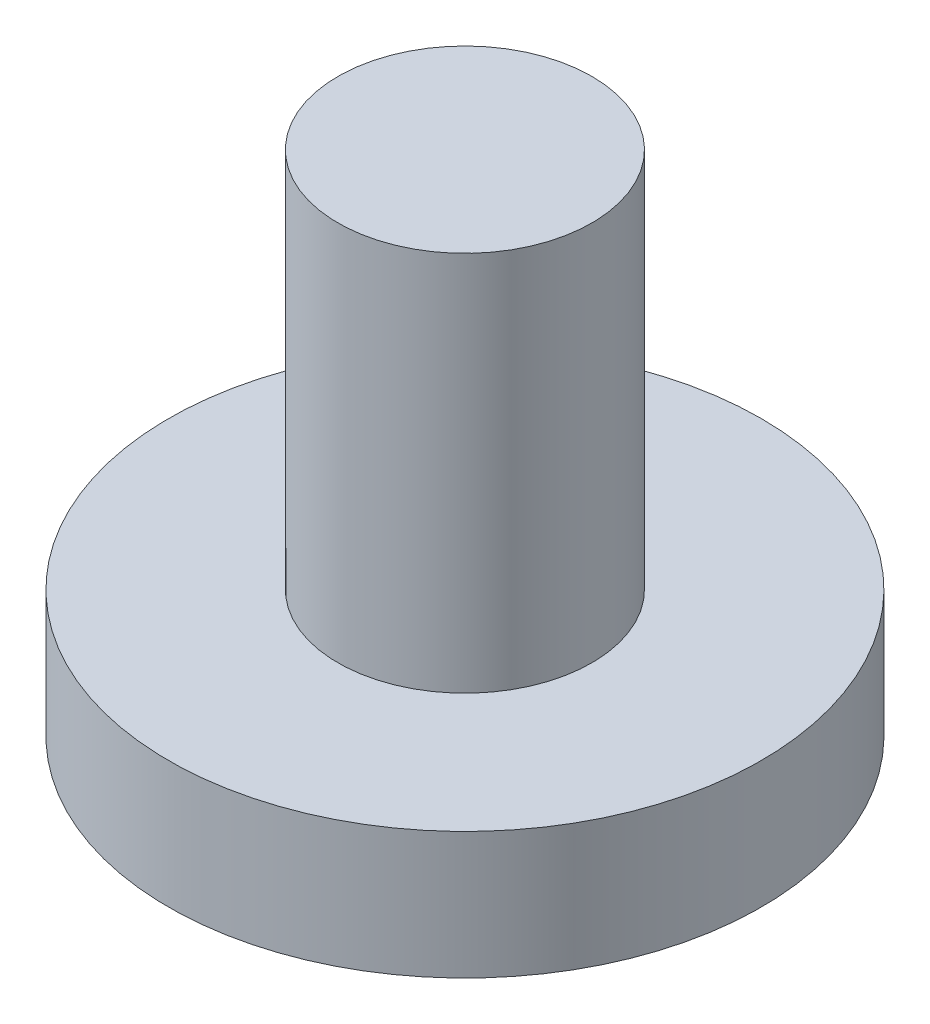
ISO-10303-21;
HEADER;
FILE_DESCRIPTION(('STEP AP214'),'2;1');
FILE_NAME('part.step','',(''),(''),'','','');
FILE_SCHEMA(('AUTOMOTIVE_DESIGN { 1 0 10303 214 1 1 1 1 }'));
ENDSEC;
DATA;
#1=APPLICATION_CONTEXT('core data for automotive mechanical design processes');
#2=APPLICATION_PROTOCOL_DEFINITION('international standard','automotive_design',2000,#1);
#3=PRODUCT_CONTEXT('',#1,'mechanical');
#4=PRODUCT('Part','Part','',(#3));
#5=PRODUCT_RELATED_PRODUCT_CATEGORY('part','',(#4));
#6=PRODUCT_DEFINITION_FORMATION('','',#4);
#7=PRODUCT_DEFINITION_CONTEXT('part definition',#1,'design');
#8=PRODUCT_DEFINITION('design','',#6,#7);
#9=PRODUCT_DEFINITION_SHAPE('','',#8);
#10=(LENGTH_UNIT() NAMED_UNIT(*) SI_UNIT(.MILLI.,.METRE.));
#11=(NAMED_UNIT(*) PLANE_ANGLE_UNIT() SI_UNIT($,.RADIAN.));
#12=(NAMED_UNIT(*) SI_UNIT($,.STERADIAN.) SOLID_ANGLE_UNIT());
#13=UNCERTAINTY_MEASURE_WITH_UNIT(LENGTH_MEASURE(1.E-05),#10,'distance_accuracy_value','');
#14=(GEOMETRIC_REPRESENTATION_CONTEXT(3) GLOBAL_UNCERTAINTY_ASSIGNED_CONTEXT((#13)) GLOBAL_UNIT_ASSIGNED_CONTEXT((#10,
#11,#12)) REPRESENTATION_CONTEXT('',''));
#15=CARTESIAN_POINT('',(0.,0.,0.));
#16=DIRECTION('',(0.,0.,1.));
#17=DIRECTION('',(1.,0.,0.));
#18=AXIS2_PLACEMENT_3D('',#15,#16,#17);
#19=CARTESIAN_POINT('',(0.,6.,0.));
#20=DIRECTION('',(0.,1.,0.));
#21=DIRECTION('',(0.,0.,1.));
#22=AXIS2_PLACEMENT_3D('',#19,#20,#21);
#23=PLANE('',#22);
#24=CARTESIAN_POINT('',(0.,6.,0.));
#25=DIRECTION('',(0.,-1.,0.));
#26=DIRECTION('',(0.,0.,-1.));
#27=AXIS2_PLACEMENT_3D('',#24,#25,#26);
#28=CIRCLE('',#27,1.5);
#29=CARTESIAN_POINT('',(0.,6.,-1.5));
#30=VERTEX_POINT('',#29);
#31=EDGE_CURVE('E19',#30,#30,#28,.T.);
#32=ORIENTED_EDGE('',*,*,#31,.F.);
#33=EDGE_LOOP('',(#32));
#34=FACE_BOUND('',#33,.T.);
#35=ADVANCED_FACE('F16',(#34),#23,.T.);
#36=CARTESIAN_POINT('',(0.,6.,0.));
#37=DIRECTION('',(0.,-1.,0.));
#38=DIRECTION('',(0.,0.,-1.));
#39=AXIS2_PLACEMENT_3D('',#36,#37,#38);
#40=CYLINDRICAL_SURFACE('',#39,1.5);
#41=CARTESIAN_POINT('',(0.,1.5,0.));
#42=DIRECTION('',(0.,-1.,0.));
#43=DIRECTION('',(0.,0.,-1.));
#44=AXIS2_PLACEMENT_3D('',#41,#42,#43);
#45=CIRCLE('',#44,1.5);
#46=CARTESIAN_POINT('',(0.,1.5,-1.5));
#47=VERTEX_POINT('',#46);
#48=EDGE_CURVE('E78',#47,#47,#45,.T.);
#49=ORIENTED_EDGE('',*,*,#48,.F.);
#50=EDGE_LOOP('',(#49));
#51=FACE_BOUND('',#50,.T.);
#52=ORIENTED_EDGE('',*,*,#31,.T.);
#53=EDGE_LOOP('',(#52));
#54=FACE_BOUND('',#53,.T.);
#55=ADVANCED_FACE('F102',(#51,#54),#40,.T.);
#56=CARTESIAN_POINT('',(0.,0.8,0.));
#57=DIRECTION('',(0.,-1.,0.));
#58=DIRECTION('',(0.,0.,-1.));
#59=AXIS2_PLACEMENT_3D('',#56,#57,#58);
#60=PLANE('',#59);
#61=DIRECTION('',(-0.5,0.,0.866025403784439));
#62=VECTOR('',#61,1.);
#63=CARTESIAN_POINT('',(-1.15470053837925,0.8,0.));
#64=LINE('',#63,#62);
#65=CARTESIAN_POINT('',(-1.15470053837925,0.8,0.));
#66=VERTEX_POINT('',#65);
#67=CARTESIAN_POINT('',(-0.577350269189626,0.8,-1.));
#68=VERTEX_POINT('',#67);
#69=EDGE_CURVE('E232',#66,#68,#64,.F.);
#70=ORIENTED_EDGE('',*,*,#69,.T.);
#71=DIRECTION('',(-1.,0.,0.));
#72=VECTOR('',#71,1.);
#73=CARTESIAN_POINT('',(-0.577350269189626,0.8,-1.));
#74=LINE('',#73,#72);
#75=CARTESIAN_POINT('',(0.577350269189627,0.8,-1.));
#76=VERTEX_POINT('',#75);
#77=EDGE_CURVE('E238',#68,#76,#74,.F.);
#78=ORIENTED_EDGE('',*,*,#77,.T.);
#79=DIRECTION('',(-0.5,0.,-0.866025403784439));
#80=VECTOR('',#79,1.);
#81=CARTESIAN_POINT('',(0.577350269189627,0.8,-1.));
#82=LINE('',#81,#80);
#83=CARTESIAN_POINT('',(1.15470053837925,0.8,0.));
#84=VERTEX_POINT('',#83);
#85=EDGE_CURVE('E246',#76,#84,#82,.F.);
#86=ORIENTED_EDGE('',*,*,#85,.T.);
#87=DIRECTION('',(0.5,0.,-0.866025403784439));
#88=VECTOR('',#87,1.);
#89=CARTESIAN_POINT('',(1.15470053837925,0.8,0.));
#90=LINE('',#89,#88);
#91=CARTESIAN_POINT('',(0.577350269189625,0.8,1.));
#92=VERTEX_POINT('',#91);
#93=EDGE_CURVE('E72',#84,#92,#90,.F.);
#94=ORIENTED_EDGE('',*,*,#93,.T.);
#95=DIRECTION('',(1.,0.,0.));
#96=VECTOR('',#95,1.);
#97=CARTESIAN_POINT('',(0.577350269189625,0.8,1.));
#98=LINE('',#97,#96);
#99=CARTESIAN_POINT('',(-0.577350269189626,0.8,1.));
#100=VERTEX_POINT('',#99);
#101=EDGE_CURVE('E70',#92,#100,#98,.F.);
#102=ORIENTED_EDGE('',*,*,#101,.T.);
#103=DIRECTION('',(0.5,0.,0.866025403784439));
#104=VECTOR('',#103,1.);
#105=CARTESIAN_POINT('',(-0.577350269189626,0.8,1.));
#106=LINE('',#105,#104);
#107=EDGE_CURVE('E67',#100,#66,#106,.F.);
#108=ORIENTED_EDGE('',*,*,#107,.T.);
#109=EDGE_LOOP('',(#70,#78,#86,#94,#102,#108));
#110=FACE_BOUND('',#109,.T.);
#111=ADVANCED_FACE('F71',(#110),#60,.T.);
#112=CARTESIAN_POINT('',(0.,1.5,0.));
#113=DIRECTION('',(0.,1.,0.));
#114=DIRECTION('',(0.,0.,1.));
#115=AXIS2_PLACEMENT_3D('',#112,#113,#114);
#116=PLANE('',#115);
#117=ORIENTED_EDGE('',*,*,#48,.T.);
#118=EDGE_LOOP('',(#117));
#119=FACE_BOUND('',#118,.T.);
#120=CARTESIAN_POINT('',(0.,1.5,0.));
#121=DIRECTION('',(0.,-1.,0.));
#122=DIRECTION('',(0.,0.,-1.));
#123=AXIS2_PLACEMENT_3D('',#120,#121,#122);
#124=CIRCLE('',#123,3.5);
#125=CARTESIAN_POINT('',(0.,1.5,-3.5));
#126=VERTEX_POINT('',#125);
#127=EDGE_CURVE('E93',#126,#126,#124,.T.);
#128=ORIENTED_EDGE('',*,*,#127,.F.);
#129=EDGE_LOOP('',(#128));
#130=FACE_BOUND('',#129,.T.);
#131=ADVANCED_FACE('F142',(#119,#130),#116,.T.);
#132=CARTESIAN_POINT('',(0.577350269189625,0.8,1.));
#133=DIRECTION('',(0.,0.,1.));
#134=DIRECTION('',(1.,0.,0.));
#135=AXIS2_PLACEMENT_3D('',#132,#133,#134);
#136=PLANE('',#135);
#137=DIRECTION('',(0.,1.,0.));
#138=VECTOR('',#137,1.);
#139=CARTESIAN_POINT('',(-0.577350269189626,0.8,1.));
#140=LINE('',#139,#138);
#141=CARTESIAN_POINT('',(-0.577350269189626,0.,1.));
#142=VERTEX_POINT('',#141);
#143=EDGE_CURVE('E77',#142,#100,#140,.T.);
#144=ORIENTED_EDGE('',*,*,#143,.T.);
#145=ORIENTED_EDGE('',*,*,#101,.F.);
#146=DIRECTION('',(0.,1.,0.));
#147=VECTOR('',#146,1.);
#148=CARTESIAN_POINT('',(0.577350269189625,0.8,1.));
#149=LINE('',#148,#147);
#150=CARTESIAN_POINT('',(0.577350269189625,0.,1.));
#151=VERTEX_POINT('',#150);
#152=EDGE_CURVE('E95',#92,#151,#149,.F.);
#153=ORIENTED_EDGE('',*,*,#152,.T.);
#154=DIRECTION('',(1.,0.,0.));
#155=VECTOR('',#154,1.);
#156=CARTESIAN_POINT('',(0.,0.,1.));
#157=LINE('',#156,#155);
#158=EDGE_CURVE('E89',#151,#142,#157,.F.);
#159=ORIENTED_EDGE('',*,*,#158,.T.);
#160=EDGE_LOOP('',(#144,#145,#153,#159));
#161=FACE_BOUND('',#160,.T.);
#162=ADVANCED_FACE('F88',(#161),#136,.F.);
#163=CARTESIAN_POINT('',(-0.577350269189626,0.8,1.));
#164=DIRECTION('',(-0.866025403784439,0.,0.5));
#165=DIRECTION('',(0.5,0.,0.866025403784439));
#166=AXIS2_PLACEMENT_3D('',#163,#164,#165);
#167=PLANE('',#166);
#168=DIRECTION('',(0.,1.,0.));
#169=VECTOR('',#168,1.);
#170=CARTESIAN_POINT('',(-1.15470053837925,0.8,0.));
#171=LINE('',#170,#169);
#172=CARTESIAN_POINT('',(-1.15470053837925,0.,0.));
#173=VERTEX_POINT('',#172);
#174=EDGE_CURVE('E85',#173,#66,#171,.T.);
#175=ORIENTED_EDGE('',*,*,#174,.T.);
#176=ORIENTED_EDGE('',*,*,#107,.F.);
#177=ORIENTED_EDGE('',*,*,#143,.F.);
#178=DIRECTION('',(-0.5,0.,-0.866025403784439));
#179=VECTOR('',#178,1.);
#180=CARTESIAN_POINT('',(-0.577350269189626,0.,1.));
#181=LINE('',#180,#179);
#182=EDGE_CURVE('E252',#142,#173,#181,.T.);
#183=ORIENTED_EDGE('',*,*,#182,.T.);
#184=EDGE_LOOP('',(#175,#176,#177,#183));
#185=FACE_BOUND('',#184,.T.);
#186=ADVANCED_FACE('F82',(#185),#167,.F.);
#187=CARTESIAN_POINT('',(-1.15470053837925,0.8,0.));
#188=DIRECTION('',(-0.866025403784439,0.,-0.5));
#189=DIRECTION('',(-0.5,0.,0.866025403784439));
#190=AXIS2_PLACEMENT_3D('',#187,#188,#189);
#191=PLANE('',#190);
#192=DIRECTION('',(0.,1.,0.));
#193=VECTOR('',#192,1.);
#194=CARTESIAN_POINT('',(-0.577350269189626,0.8,-1.));
#195=LINE('',#194,#193);
#196=CARTESIAN_POINT('',(-0.577350269189626,0.,-1.));
#197=VERTEX_POINT('',#196);
#198=EDGE_CURVE('E231',#197,#68,#195,.T.);
#199=ORIENTED_EDGE('',*,*,#198,.T.);
#200=ORIENTED_EDGE('',*,*,#69,.F.);
#201=ORIENTED_EDGE('',*,*,#174,.F.);
#202=DIRECTION('',(0.5,0.,-0.866025403784439));
#203=VECTOR('',#202,1.);
#204=CARTESIAN_POINT('',(-1.15470053837925,0.,0.));
#205=LINE('',#204,#203);
#206=EDGE_CURVE('E234',#173,#197,#205,.T.);
#207=ORIENTED_EDGE('',*,*,#206,.T.);
#208=EDGE_LOOP('',(#199,#200,#201,#207));
#209=FACE_BOUND('',#208,.T.);
#210=ADVANCED_FACE('F133',(#209),#191,.F.);
#211=CARTESIAN_POINT('',(-0.577350269189626,0.8,-1.));
#212=DIRECTION('',(0.,0.,-1.));
#213=DIRECTION('',(-1.,0.,0.));
#214=AXIS2_PLACEMENT_3D('',#211,#212,#213);
#215=PLANE('',#214);
#216=DIRECTION('',(0.,1.,0.));
#217=VECTOR('',#216,1.);
#218=CARTESIAN_POINT('',(0.577350269189627,0.8,-1.));
#219=LINE('',#218,#217);
#220=CARTESIAN_POINT('',(0.577350269189627,0.,-1.));
#221=VERTEX_POINT('',#220);
#222=EDGE_CURVE('E240',#221,#76,#219,.T.);
#223=ORIENTED_EDGE('',*,*,#222,.T.);
#224=ORIENTED_EDGE('',*,*,#77,.F.);
#225=ORIENTED_EDGE('',*,*,#198,.F.);
#226=DIRECTION('',(1.,0.,0.));
#227=VECTOR('',#226,1.);
#228=CARTESIAN_POINT('',(0.,0.,-1.));
#229=LINE('',#228,#227);
#230=EDGE_CURVE('E255',#197,#221,#229,.T.);
#231=ORIENTED_EDGE('',*,*,#230,.T.);
#232=EDGE_LOOP('',(#223,#224,#225,#231));
#233=FACE_BOUND('',#232,.T.);
#234=ADVANCED_FACE('F129',(#233),#215,.F.);
#235=CARTESIAN_POINT('',(0.577350269189627,0.8,-1.));
#236=DIRECTION('',(0.866025403784439,0.,-0.5));
#237=DIRECTION('',(-0.5,0.,-0.866025403784439));
#238=AXIS2_PLACEMENT_3D('',#235,#236,#237);
#239=PLANE('',#238);
#240=DIRECTION('',(0.,1.,0.));
#241=VECTOR('',#240,1.);
#242=CARTESIAN_POINT('',(1.15470053837925,0.8,0.));
#243=LINE('',#242,#241);
#244=CARTESIAN_POINT('',(1.15470053837925,0.,0.));
#245=VERTEX_POINT('',#244);
#246=EDGE_CURVE('E34',#245,#84,#243,.T.);
#247=ORIENTED_EDGE('',*,*,#246,.T.);
#248=ORIENTED_EDGE('',*,*,#85,.F.);
#249=ORIENTED_EDGE('',*,*,#222,.F.);
#250=DIRECTION('',(0.5,0.,0.866025403784438));
#251=VECTOR('',#250,1.);
#252=CARTESIAN_POINT('',(0.577350269189627,0.,-1.));
#253=LINE('',#252,#251);
#254=EDGE_CURVE('E257',#221,#245,#253,.T.);
#255=ORIENTED_EDGE('',*,*,#254,.T.);
#256=EDGE_LOOP('',(#247,#248,#249,#255));
#257=FACE_BOUND('',#256,.T.);
#258=ADVANCED_FACE('F126',(#257),#239,.F.);
#259=CARTESIAN_POINT('',(1.15470053837925,0.8,0.));
#260=DIRECTION('',(0.866025403784439,0.,0.5));
#261=DIRECTION('',(0.5,0.,-0.866025403784439));
#262=AXIS2_PLACEMENT_3D('',#259,#260,#261);
#263=PLANE('',#262);
#264=ORIENTED_EDGE('',*,*,#152,.F.);
#265=ORIENTED_EDGE('',*,*,#93,.F.);
#266=ORIENTED_EDGE('',*,*,#246,.F.);
#267=DIRECTION('',(-0.5,0.,0.866025403784438));
#268=VECTOR('',#267,1.);
#269=CARTESIAN_POINT('',(1.15470053837925,0.,0.));
#270=LINE('',#269,#268);
#271=EDGE_CURVE('E25',#245,#151,#270,.T.);
#272=ORIENTED_EDGE('',*,*,#271,.T.);
#273=EDGE_LOOP('',(#264,#265,#266,#272));
#274=FACE_BOUND('',#273,.T.);
#275=ADVANCED_FACE('F118',(#274),#263,.F.);
#276=CARTESIAN_POINT('',(0.,1.5,0.));
#277=DIRECTION('',(0.,-1.,0.));
#278=DIRECTION('',(0.,0.,-1.));
#279=AXIS2_PLACEMENT_3D('',#276,#277,#278);
#280=CYLINDRICAL_SURFACE('',#279,3.5);
#281=ORIENTED_EDGE('',*,*,#127,.T.);
#282=EDGE_LOOP('',(#281));
#283=FACE_BOUND('',#282,.T.);
#284=CARTESIAN_POINT('',(0.,0.,0.));
#285=DIRECTION('',(0.,-1.,0.));
#286=DIRECTION('',(0.,0.,-1.));
#287=AXIS2_PLACEMENT_3D('',#284,#285,#286);
#288=CIRCLE('',#287,3.5);
#289=CARTESIAN_POINT('',(0.,0.,-3.5));
#290=VERTEX_POINT('',#289);
#291=EDGE_CURVE('E11',#290,#290,#288,.F.);
#292=ORIENTED_EDGE('',*,*,#291,.T.);
#293=EDGE_LOOP('',(#292));
#294=FACE_BOUND('',#293,.T.);
#295=ADVANCED_FACE('F112',(#283,#294),#280,.T.);
#296=CARTESIAN_POINT('',(0.,0.,0.));
#297=DIRECTION('',(0.,1.,0.));
#298=DIRECTION('',(0.,0.,1.));
#299=AXIS2_PLACEMENT_3D('',#296,#297,#298);
#300=PLANE('',#299);
#301=ORIENTED_EDGE('',*,*,#291,.F.);
#302=EDGE_LOOP('',(#301));
#303=FACE_BOUND('',#302,.T.);
#304=ORIENTED_EDGE('',*,*,#254,.F.);
#305=ORIENTED_EDGE('',*,*,#230,.F.);
#306=ORIENTED_EDGE('',*,*,#206,.F.);
#307=ORIENTED_EDGE('',*,*,#182,.F.);
#308=ORIENTED_EDGE('',*,*,#158,.F.);
#309=ORIENTED_EDGE('',*,*,#271,.F.);
#310=EDGE_LOOP('',(#304,#305,#306,#307,#308,#309));
#311=FACE_BOUND('',#310,.T.);
#312=ADVANCED_FACE('F110',(#303,#311),#300,.F.);
#313=CLOSED_SHELL('',(#35,#55,#111,#131,#162,#186,#210,#234,#258,#275,#295,#312));
#314=MANIFOLD_SOLID_BREP('B1',#313);
#315=ADVANCED_BREP_SHAPE_REPRESENTATION('',(#18,#314),#14);
#316=SHAPE_DEFINITION_REPRESENTATION(#9,#315);
ENDSEC;
END-ISO-10303-21;
